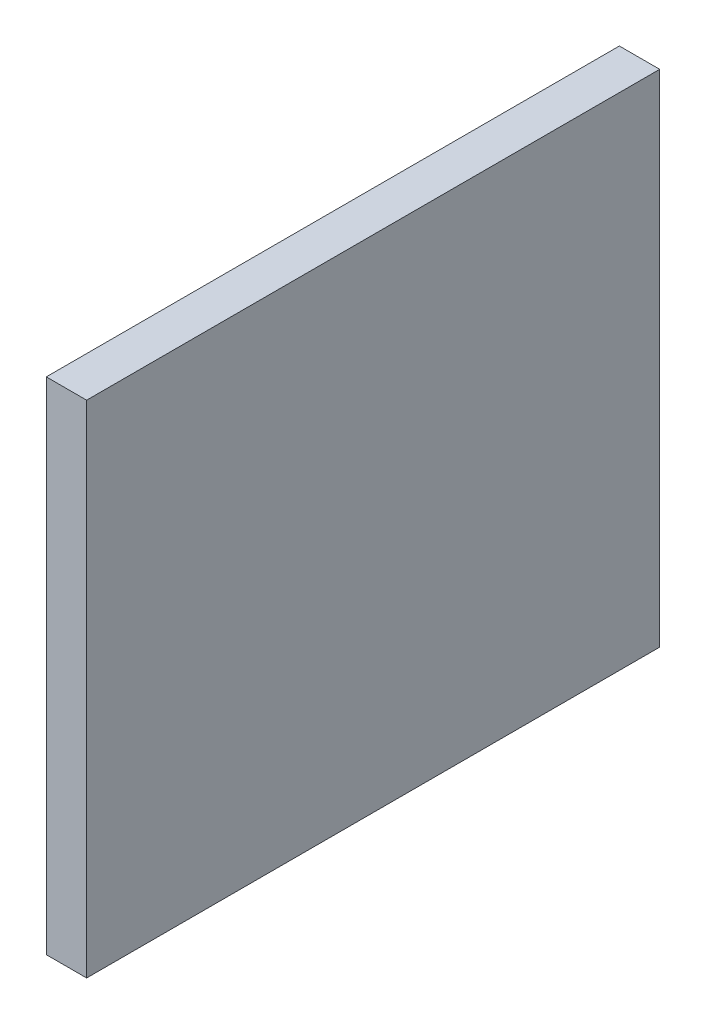
ISO-10303-21;
HEADER;
FILE_DESCRIPTION(('STEP AP214'),'2;1');
FILE_NAME('part.step','',(''),(''),'','','');
FILE_SCHEMA(('AUTOMOTIVE_DESIGN { 1 0 10303 214 1 1 1 1 }'));
ENDSEC;
DATA;
#1=APPLICATION_CONTEXT('core data for automotive mechanical design processes');
#2=APPLICATION_PROTOCOL_DEFINITION('international standard','automotive_design',2000,#1);
#3=PRODUCT_CONTEXT('',#1,'mechanical');
#4=PRODUCT('Part','Part','',(#3));
#5=PRODUCT_RELATED_PRODUCT_CATEGORY('part','',(#4));
#6=PRODUCT_DEFINITION_FORMATION('','',#4);
#7=PRODUCT_DEFINITION_CONTEXT('part definition',#1,'design');
#8=PRODUCT_DEFINITION('design','',#6,#7);
#9=PRODUCT_DEFINITION_SHAPE('','',#8);
#10=(LENGTH_UNIT() NAMED_UNIT(*) SI_UNIT(.MILLI.,.METRE.));
#11=(NAMED_UNIT(*) PLANE_ANGLE_UNIT() SI_UNIT($,.RADIAN.));
#12=(NAMED_UNIT(*) SI_UNIT($,.STERADIAN.) SOLID_ANGLE_UNIT());
#13=UNCERTAINTY_MEASURE_WITH_UNIT(LENGTH_MEASURE(1.E-05),#10,'distance_accuracy_value','');
#14=(GEOMETRIC_REPRESENTATION_CONTEXT(3) GLOBAL_UNCERTAINTY_ASSIGNED_CONTEXT((#13)) GLOBAL_UNIT_ASSIGNED_CONTEXT((#10,
#11,#12)) REPRESENTATION_CONTEXT('',''));
#15=CARTESIAN_POINT('',(0.,0.,0.));
#16=DIRECTION('',(0.,0.,1.));
#17=DIRECTION('',(1.,0.,0.));
#18=AXIS2_PLACEMENT_3D('',#15,#16,#17);
#19=CARTESIAN_POINT('',(5.,-62.,142.));
#20=DIRECTION('',(-1.,0.,0.));
#21=DIRECTION('',(0.,0.,1.));
#22=AXIS2_PLACEMENT_3D('',#19,#20,#21);
#23=PLANE('',#22);
#24=DIRECTION('',(0.,1.,0.));
#25=VECTOR('',#24,1.);
#26=CARTESIAN_POINT('',(5.,-62.,0.));
#27=LINE('',#26,#25);
#28=CARTESIAN_POINT('',(5.,-62.,0.));
#29=VERTEX_POINT('',#28);
#30=CARTESIAN_POINT('',(5.,62.,0.));
#31=VERTEX_POINT('',#30);
#32=EDGE_CURVE('E100',#29,#31,#27,.T.);
#33=ORIENTED_EDGE('',*,*,#32,.T.);
#34=DIRECTION('',(0.,0.,-1.));
#35=VECTOR('',#34,1.);
#36=CARTESIAN_POINT('',(5.,62.,142.));
#37=LINE('',#36,#35);
#38=CARTESIAN_POINT('',(5.,62.,142.));
#39=VERTEX_POINT('',#38);
#40=EDGE_CURVE('E11',#39,#31,#37,.T.);
#41=ORIENTED_EDGE('',*,*,#40,.F.);
#42=DIRECTION('',(0.,1.,0.));
#43=VECTOR('',#42,1.);
#44=CARTESIAN_POINT('',(5.,-62.,142.));
#45=LINE('',#44,#43);
#46=CARTESIAN_POINT('',(5.,-62.,142.));
#47=VERTEX_POINT('',#46);
#48=EDGE_CURVE('E88',#47,#39,#45,.T.);
#49=ORIENTED_EDGE('',*,*,#48,.F.);
#50=DIRECTION('',(0.,0.,-1.));
#51=VECTOR('',#50,1.);
#52=CARTESIAN_POINT('',(5.,-62.,142.));
#53=LINE('',#52,#51);
#54=EDGE_CURVE('E96',#47,#29,#53,.T.);
#55=ORIENTED_EDGE('',*,*,#54,.T.);
#56=EDGE_LOOP('',(#33,#41,#49,#55));
#57=FACE_BOUND('',#56,.T.);
#58=ADVANCED_FACE('F37',(#57),#23,.F.);
#59=CARTESIAN_POINT('',(-5.,62.,142.));
#60=DIRECTION('',(0.,-1.,0.));
#61=DIRECTION('',(0.,0.,-1.));
#62=AXIS2_PLACEMENT_3D('',#59,#60,#61);
#63=PLANE('',#62);
#64=DIRECTION('',(-1.,0.,0.));
#65=VECTOR('',#64,1.);
#66=CARTESIAN_POINT('',(-5.,62.,0.));
#67=LINE('',#66,#65);
#68=CARTESIAN_POINT('',(-5.,62.,0.));
#69=VERTEX_POINT('',#68);
#70=EDGE_CURVE('E92',#31,#69,#67,.T.);
#71=ORIENTED_EDGE('',*,*,#70,.T.);
#72=DIRECTION('',(0.,0.,-1.));
#73=VECTOR('',#72,1.);
#74=CARTESIAN_POINT('',(-5.,62.,142.));
#75=LINE('',#74,#73);
#76=CARTESIAN_POINT('',(-5.,62.,142.));
#77=VERTEX_POINT('',#76);
#78=EDGE_CURVE('E45',#77,#69,#75,.T.);
#79=ORIENTED_EDGE('',*,*,#78,.F.);
#80=DIRECTION('',(-1.,0.,0.));
#81=VECTOR('',#80,1.);
#82=CARTESIAN_POINT('',(-5.,62.,142.));
#83=LINE('',#82,#81);
#84=EDGE_CURVE('E83',#39,#77,#83,.T.);
#85=ORIENTED_EDGE('',*,*,#84,.F.);
#86=ORIENTED_EDGE('',*,*,#40,.T.);
#87=EDGE_LOOP('',(#71,#79,#85,#86));
#88=FACE_BOUND('',#87,.T.);
#89=ADVANCED_FACE('F91',(#88),#63,.F.);
#90=CARTESIAN_POINT('',(-5.,-62.,142.));
#91=DIRECTION('',(1.,0.,0.));
#92=DIRECTION('',(0.,0.,-1.));
#93=AXIS2_PLACEMENT_3D('',#90,#91,#92);
#94=PLANE('',#93);
#95=DIRECTION('',(0.,-1.,0.));
#96=VECTOR('',#95,1.);
#97=CARTESIAN_POINT('',(-5.,-62.,0.));
#98=LINE('',#97,#96);
#99=CARTESIAN_POINT('',(-5.,-62.,0.));
#100=VERTEX_POINT('',#99);
#101=EDGE_CURVE('E70',#69,#100,#98,.T.);
#102=ORIENTED_EDGE('',*,*,#101,.T.);
#103=DIRECTION('',(0.,0.,-1.));
#104=VECTOR('',#103,1.);
#105=CARTESIAN_POINT('',(-5.,-62.,142.));
#106=LINE('',#105,#104);
#107=CARTESIAN_POINT('',(-5.,-62.,142.));
#108=VERTEX_POINT('',#107);
#109=EDGE_CURVE('E93',#108,#100,#106,.T.);
#110=ORIENTED_EDGE('',*,*,#109,.F.);
#111=DIRECTION('',(0.,-1.,0.));
#112=VECTOR('',#111,1.);
#113=CARTESIAN_POINT('',(-5.,-62.,142.));
#114=LINE('',#113,#112);
#115=EDGE_CURVE('E86',#77,#108,#114,.T.);
#116=ORIENTED_EDGE('',*,*,#115,.F.);
#117=ORIENTED_EDGE('',*,*,#78,.T.);
#118=EDGE_LOOP('',(#102,#110,#116,#117));
#119=FACE_BOUND('',#118,.T.);
#120=ADVANCED_FACE('F94',(#119),#94,.F.);
#121=CARTESIAN_POINT('',(-5.,-62.,142.));
#122=DIRECTION('',(0.,1.,0.));
#123=DIRECTION('',(0.,0.,1.));
#124=AXIS2_PLACEMENT_3D('',#121,#122,#123);
#125=PLANE('',#124);
#126=DIRECTION('',(1.,0.,0.));
#127=VECTOR('',#126,1.);
#128=CARTESIAN_POINT('',(-5.,-62.,0.));
#129=LINE('',#128,#127);
#130=EDGE_CURVE('E76',#100,#29,#129,.T.);
#131=ORIENTED_EDGE('',*,*,#130,.T.);
#132=ORIENTED_EDGE('',*,*,#54,.F.);
#133=DIRECTION('',(1.,0.,0.));
#134=VECTOR('',#133,1.);
#135=CARTESIAN_POINT('',(-5.,-62.,142.));
#136=LINE('',#135,#134);
#137=EDGE_CURVE('E53',#108,#47,#136,.T.);
#138=ORIENTED_EDGE('',*,*,#137,.F.);
#139=ORIENTED_EDGE('',*,*,#109,.T.);
#140=EDGE_LOOP('',(#131,#132,#138,#139));
#141=FACE_BOUND('',#140,.T.);
#142=ADVANCED_FACE('F107',(#141),#125,.F.);
#143=CARTESIAN_POINT('',(0.,0.,142.));
#144=DIRECTION('',(0.,0.,-1.));
#145=DIRECTION('',(-1.,0.,0.));
#146=AXIS2_PLACEMENT_3D('',#143,#144,#145);
#147=PLANE('',#146);
#148=ORIENTED_EDGE('',*,*,#48,.T.);
#149=ORIENTED_EDGE('',*,*,#84,.T.);
#150=ORIENTED_EDGE('',*,*,#115,.T.);
#151=ORIENTED_EDGE('',*,*,#137,.T.);
#152=EDGE_LOOP('',(#148,#149,#150,#151));
#153=FACE_BOUND('',#152,.T.);
#154=ADVANCED_FACE('F84',(#153),#147,.F.);
#155=CARTESIAN_POINT('',(0.,0.,0.));
#156=DIRECTION('',(0.,0.,-1.));
#157=DIRECTION('',(-1.,0.,0.));
#158=AXIS2_PLACEMENT_3D('',#155,#156,#157);
#159=PLANE('',#158);
#160=ORIENTED_EDGE('',*,*,#32,.F.);
#161=ORIENTED_EDGE('',*,*,#130,.F.);
#162=ORIENTED_EDGE('',*,*,#101,.F.);
#163=ORIENTED_EDGE('',*,*,#70,.F.);
#164=EDGE_LOOP('',(#160,#161,#162,#163));
#165=FACE_BOUND('',#164,.T.);
#166=ADVANCED_FACE('F110',(#165),#159,.T.);
#167=CLOSED_SHELL('',(#58,#89,#120,#142,#154,#166));
#168=MANIFOLD_SOLID_BREP('B2',#167);
#169=ADVANCED_BREP_SHAPE_REPRESENTATION('',(#18,#168),#14);
#170=SHAPE_DEFINITION_REPRESENTATION(#9,#169);
ENDSEC;
END-ISO-10303-21;
